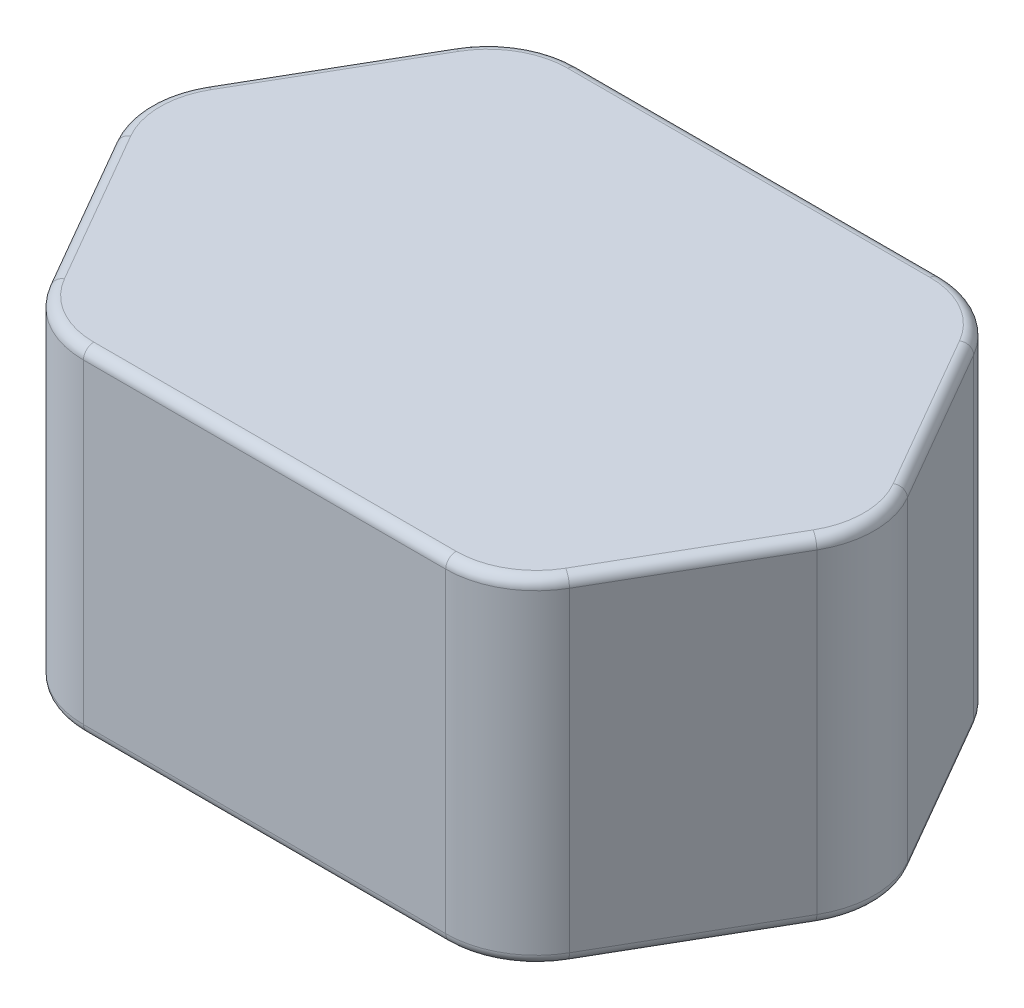
ISO-10303-21;
HEADER;
FILE_DESCRIPTION(('STEP AP214'),'2;1');
FILE_NAME('part.step','',(''),(''),'','','');
FILE_SCHEMA(('AUTOMOTIVE_DESIGN { 1 0 10303 214 1 1 1 1 }'));
ENDSEC;
DATA;
#1=APPLICATION_CONTEXT('core data for automotive mechanical design processes');
#2=APPLICATION_PROTOCOL_DEFINITION('international standard','automotive_design',2000,#1);
#3=PRODUCT_CONTEXT('',#1,'mechanical');
#4=PRODUCT('Part','Part','',(#3));
#5=PRODUCT_RELATED_PRODUCT_CATEGORY('part','',(#4));
#6=PRODUCT_DEFINITION_FORMATION('','',#4);
#7=PRODUCT_DEFINITION_CONTEXT('part definition',#1,'design');
#8=PRODUCT_DEFINITION('design','',#6,#7);
#9=PRODUCT_DEFINITION_SHAPE('','',#8);
#10=(LENGTH_UNIT() NAMED_UNIT(*) SI_UNIT(.MILLI.,.METRE.));
#11=(NAMED_UNIT(*) PLANE_ANGLE_UNIT() SI_UNIT($,.RADIAN.));
#12=(NAMED_UNIT(*) SI_UNIT($,.STERADIAN.) SOLID_ANGLE_UNIT());
#13=UNCERTAINTY_MEASURE_WITH_UNIT(LENGTH_MEASURE(1.E-05),#10,'distance_accuracy_value','');
#14=(GEOMETRIC_REPRESENTATION_CONTEXT(3) GLOBAL_UNCERTAINTY_ASSIGNED_CONTEXT((#13)) GLOBAL_UNIT_ASSIGNED_CONTEXT((#10,
#11,#12)) REPRESENTATION_CONTEXT('',''));
#15=CARTESIAN_POINT('',(0.,0.,0.));
#16=DIRECTION('',(0.,0.,1.));
#17=DIRECTION('',(1.,0.,0.));
#18=AXIS2_PLACEMENT_3D('',#15,#16,#17);
#19=CARTESIAN_POINT('',(0.,65.,0.));
#20=DIRECTION('',(0.,-1.,0.));
#21=DIRECTION('',(0.,0.,-1.));
#22=AXIS2_PLACEMENT_3D('',#19,#20,#21);
#23=CYLINDRICAL_SURFACE('',#22,17.4999999999999);
#24=DIRECTION('',(0.,-1.,0.));
#25=VECTOR('',#24,1.);
#26=CARTESIAN_POINT('',(-15.1554445662275,65.,-8.75000000000017));
#27=LINE('',#26,#25);
#28=CARTESIAN_POINT('',(-15.1554445662275,63.,-8.75000000000017));
#29=VERTEX_POINT('',#28);
#30=CARTESIAN_POINT('',(-15.1554445662275,2.,-8.75000000000017));
#31=VERTEX_POINT('',#30);
#32=EDGE_CURVE('E360',#29,#31,#27,.T.);
#33=ORIENTED_EDGE('',*,*,#32,.T.);
#34=CARTESIAN_POINT('',(0.,2.,0.));
#35=DIRECTION('',(0.,1.,0.));
#36=DIRECTION('',(0.,0.,1.));
#37=AXIS2_PLACEMENT_3D('',#34,#35,#36);
#38=CIRCLE('',#37,17.4999999999999);
#39=CARTESIAN_POINT('',(-15.1554445662276,2.,8.75000000000001));
#40=VERTEX_POINT('',#39);
#41=EDGE_CURVE('E305',#31,#40,#38,.T.);
#42=ORIENTED_EDGE('',*,*,#41,.T.);
#43=DIRECTION('',(0.,-1.,0.));
#44=VECTOR('',#43,1.);
#45=CARTESIAN_POINT('',(-15.1554445662276,65.,8.75000000000001));
#46=LINE('',#45,#44);
#47=CARTESIAN_POINT('',(-15.1554445662276,63.,8.75000000000001));
#48=VERTEX_POINT('',#47);
#49=EDGE_CURVE('E220',#48,#40,#46,.T.);
#50=ORIENTED_EDGE('',*,*,#49,.F.);
#51=CARTESIAN_POINT('',(0.,63.,0.));
#52=DIRECTION('',(0.,1.,0.));
#53=DIRECTION('',(0.,0.,1.));
#54=AXIS2_PLACEMENT_3D('',#51,#52,#53);
#55=CIRCLE('',#54,17.4999999999999);
#56=EDGE_CURVE('E303',#48,#29,#55,.F.);
#57=ORIENTED_EDGE('',*,*,#56,.T.);
#58=EDGE_LOOP('',(#33,#42,#50,#57));
#59=FACE_BOUND('',#58,.T.);
#60=ADVANCED_FACE('F36',(#59),#23,.T.);
#61=CARTESIAN_POINT('',(2.34455543377243,65.,39.0608891324552));
#62=DIRECTION('',(0.866025403784437,0.,-0.500000000000002));
#63=DIRECTION('',(-0.500000000000002,0.,-0.866025403784437));
#64=AXIS2_PLACEMENT_3D('',#61,#62,#63);
#65=PLANE('',#64);
#66=ORIENTED_EDGE('',*,*,#49,.T.);
#67=DIRECTION('',(0.500000000000002,0.,0.866025403784437));
#68=VECTOR('',#67,1.);
#69=CARTESIAN_POINT('',(2.34455543377243,2.,39.0608891324552));
#70=LINE('',#69,#68);
#71=CARTESIAN_POINT('',(2.34455543377247,2.,39.0608891324552));
#72=VERTEX_POINT('',#71);
#73=EDGE_CURVE('E219',#40,#72,#70,.T.);
#74=ORIENTED_EDGE('',*,*,#73,.T.);
#75=DIRECTION('',(0.,-1.,0.));
#76=VECTOR('',#75,1.);
#77=CARTESIAN_POINT('',(2.34455543377247,65.,39.0608891324552));
#78=LINE('',#77,#76);
#79=CARTESIAN_POINT('',(2.34455543377247,63.,39.0608891324552));
#80=VERTEX_POINT('',#79);
#81=EDGE_CURVE('E201',#80,#72,#78,.T.);
#82=ORIENTED_EDGE('',*,*,#81,.F.);
#83=DIRECTION('',(0.500000000000002,0.,0.866025403784437));
#84=VECTOR('',#83,1.);
#85=CARTESIAN_POINT('',(-15.1554445662276,63.,8.75000000000001));
#86=LINE('',#85,#84);
#87=EDGE_CURVE('E216',#80,#48,#86,.F.);
#88=ORIENTED_EDGE('',*,*,#87,.T.);
#89=EDGE_LOOP('',(#66,#74,#82,#88));
#90=FACE_BOUND('',#89,.T.);
#91=ADVANCED_FACE('F214',(#90),#65,.F.);
#92=CARTESIAN_POINT('',(17.5,65.,30.3108891324552));
#93=DIRECTION('',(0.,-1.,0.));
#94=DIRECTION('',(0.,0.,-1.));
#95=AXIS2_PLACEMENT_3D('',#92,#93,#94);
#96=CYLINDRICAL_SURFACE('',#95,17.4999999999999);
#97=ORIENTED_EDGE('',*,*,#81,.T.);
#98=CARTESIAN_POINT('',(17.5,2.,30.3108891324552));
#99=DIRECTION('',(0.,1.,0.));
#100=DIRECTION('',(0.,0.,1.));
#101=AXIS2_PLACEMENT_3D('',#98,#99,#100);
#102=CIRCLE('',#101,17.4999999999999);
#103=CARTESIAN_POINT('',(17.5,2.,47.810889132455));
#104=VERTEX_POINT('',#103);
#105=EDGE_CURVE('E208',#72,#104,#102,.T.);
#106=ORIENTED_EDGE('',*,*,#105,.T.);
#107=DIRECTION('',(0.,-1.,0.));
#108=VECTOR('',#107,1.);
#109=CARTESIAN_POINT('',(17.5,65.,47.810889132455));
#110=LINE('',#109,#108);
#111=CARTESIAN_POINT('',(17.5,63.,47.810889132455));
#112=VERTEX_POINT('',#111);
#113=EDGE_CURVE('E203',#112,#104,#110,.T.);
#114=ORIENTED_EDGE('',*,*,#113,.F.);
#115=CARTESIAN_POINT('',(17.5,63.,30.3108891324552));
#116=DIRECTION('',(0.,1.,0.));
#117=DIRECTION('',(0.,0.,1.));
#118=AXIS2_PLACEMENT_3D('',#115,#116,#117);
#119=CIRCLE('',#118,17.4999999999999);
#120=EDGE_CURVE('E198',#112,#80,#119,.F.);
#121=ORIENTED_EDGE('',*,*,#120,.T.);
#122=EDGE_LOOP('',(#97,#106,#114,#121));
#123=FACE_BOUND('',#122,.T.);
#124=ADVANCED_FACE('F200',(#123),#96,.T.);
#125=CARTESIAN_POINT('',(87.4999999999988,65.,47.8108891324551));
#126=DIRECTION('',(0.,0.,-1.));
#127=DIRECTION('',(-1.,0.,0.));
#128=AXIS2_PLACEMENT_3D('',#125,#126,#127);
#129=PLANE('',#128);
#130=ORIENTED_EDGE('',*,*,#113,.T.);
#131=DIRECTION('',(1.,0.,0.));
#132=VECTOR('',#131,1.);
#133=CARTESIAN_POINT('',(87.4999999999988,2.,47.8108891324551));
#134=LINE('',#133,#132);
#135=CARTESIAN_POINT('',(87.4999999999988,2.,47.8108891324551));
#136=VERTEX_POINT('',#135);
#137=EDGE_CURVE('E268',#104,#136,#134,.T.);
#138=ORIENTED_EDGE('',*,*,#137,.T.);
#139=DIRECTION('',(0.,-1.,0.));
#140=VECTOR('',#139,1.);
#141=CARTESIAN_POINT('',(87.4999999999988,65.,47.8108891324551));
#142=LINE('',#141,#140);
#143=CARTESIAN_POINT('',(87.4999999999988,63.,47.8108891324551));
#144=VERTEX_POINT('',#143);
#145=EDGE_CURVE('E410',#144,#136,#142,.T.);
#146=ORIENTED_EDGE('',*,*,#145,.F.);
#147=DIRECTION('',(1.,0.,0.));
#148=VECTOR('',#147,1.);
#149=CARTESIAN_POINT('',(17.5,63.,47.810889132455));
#150=LINE('',#149,#148);
#151=EDGE_CURVE('E266',#144,#112,#150,.F.);
#152=ORIENTED_EDGE('',*,*,#151,.T.);
#153=EDGE_LOOP('',(#130,#138,#146,#152));
#154=FACE_BOUND('',#153,.T.);
#155=ADVANCED_FACE('F419',(#154),#129,.F.);
#156=CARTESIAN_POINT('',(87.4999999999988,65.,30.310889132455));
#157=DIRECTION('',(0.,-1.,0.));
#158=DIRECTION('',(0.,0.,-1.));
#159=AXIS2_PLACEMENT_3D('',#156,#157,#158);
#160=CYLINDRICAL_SURFACE('',#159,17.5);
#161=ORIENTED_EDGE('',*,*,#145,.T.);
#162=CARTESIAN_POINT('',(87.4999999999988,2.,30.310889132455));
#163=DIRECTION('',(0.,1.,0.));
#164=DIRECTION('',(0.,0.,1.));
#165=AXIS2_PLACEMENT_3D('',#162,#163,#164);
#166=CIRCLE('',#165,17.5);
#167=CARTESIAN_POINT('',(102.655444566227,2.,39.060889132455));
#168=VERTEX_POINT('',#167);
#169=EDGE_CURVE('E272',#136,#168,#166,.T.);
#170=ORIENTED_EDGE('',*,*,#169,.T.);
#171=DIRECTION('',(0.,-1.,0.));
#172=VECTOR('',#171,1.);
#173=CARTESIAN_POINT('',(102.655444566227,65.,39.060889132455));
#174=LINE('',#173,#172);
#175=CARTESIAN_POINT('',(102.655444566227,63.,39.060889132455));
#176=VERTEX_POINT('',#175);
#177=EDGE_CURVE('E401',#176,#168,#174,.T.);
#178=ORIENTED_EDGE('',*,*,#177,.F.);
#179=CARTESIAN_POINT('',(87.4999999999988,63.,30.310889132455));
#180=DIRECTION('',(0.,1.,0.));
#181=DIRECTION('',(0.,0.,1.));
#182=AXIS2_PLACEMENT_3D('',#179,#180,#181);
#183=CIRCLE('',#182,17.5);
#184=EDGE_CURVE('E270',#176,#144,#183,.F.);
#185=ORIENTED_EDGE('',*,*,#184,.T.);
#186=EDGE_LOOP('',(#161,#170,#178,#185));
#187=FACE_BOUND('',#186,.T.);
#188=ADVANCED_FACE('F407',(#187),#160,.T.);
#189=CARTESIAN_POINT('',(120.155444566226,65.,8.74999999999999));
#190=DIRECTION('',(-0.866025403784439,0.,-0.499999999999999));
#191=DIRECTION('',(-0.499999999999999,0.,0.86602540378444));
#192=AXIS2_PLACEMENT_3D('',#189,#190,#191);
#193=PLANE('',#192);
#194=ORIENTED_EDGE('',*,*,#177,.T.);
#195=DIRECTION('',(0.499999999999999,0.,-0.86602540378444));
#196=VECTOR('',#195,1.);
#197=CARTESIAN_POINT('',(120.155444566226,2.,8.74999999999999));
#198=LINE('',#197,#196);
#199=CARTESIAN_POINT('',(120.155444566226,2.,8.75));
#200=VERTEX_POINT('',#199);
#201=EDGE_CURVE('E276',#168,#200,#198,.T.);
#202=ORIENTED_EDGE('',*,*,#201,.T.);
#203=DIRECTION('',(0.,-1.,0.));
#204=VECTOR('',#203,1.);
#205=CARTESIAN_POINT('',(120.155444566226,65.,8.75));
#206=LINE('',#205,#204);
#207=CARTESIAN_POINT('',(120.155444566226,63.,8.75));
#208=VERTEX_POINT('',#207);
#209=EDGE_CURVE('E404',#208,#200,#206,.T.);
#210=ORIENTED_EDGE('',*,*,#209,.F.);
#211=DIRECTION('',(0.499999999999999,0.,-0.86602540378444));
#212=VECTOR('',#211,1.);
#213=CARTESIAN_POINT('',(102.655444566227,63.,39.060889132455));
#214=LINE('',#213,#212);
#215=EDGE_CURVE('E274',#208,#176,#214,.F.);
#216=ORIENTED_EDGE('',*,*,#215,.T.);
#217=EDGE_LOOP('',(#194,#202,#210,#216));
#218=FACE_BOUND('',#217,.T.);
#219=ADVANCED_FACE('F400',(#218),#193,.F.);
#220=CARTESIAN_POINT('',(104.999999999999,65.,0.));
#221=DIRECTION('',(0.,-1.,0.));
#222=DIRECTION('',(0.,0.,-1.));
#223=AXIS2_PLACEMENT_3D('',#220,#221,#222);
#224=CYLINDRICAL_SURFACE('',#223,17.5);
#225=ORIENTED_EDGE('',*,*,#209,.T.);
#226=CARTESIAN_POINT('',(104.999999999999,2.,0.));
#227=DIRECTION('',(0.,1.,0.));
#228=DIRECTION('',(0.,0.,1.));
#229=AXIS2_PLACEMENT_3D('',#226,#227,#228);
#230=CIRCLE('',#229,17.5);
#231=CARTESIAN_POINT('',(120.155444566227,2.,-8.74999999999951));
#232=VERTEX_POINT('',#231);
#233=EDGE_CURVE('E280',#200,#232,#230,.T.);
#234=ORIENTED_EDGE('',*,*,#233,.T.);
#235=DIRECTION('',(0.,-1.,0.));
#236=VECTOR('',#235,1.);
#237=CARTESIAN_POINT('',(120.155444566227,65.,-8.74999999999951));
#238=LINE('',#237,#236);
#239=CARTESIAN_POINT('',(120.155444566227,63.,-8.74999999999951));
#240=VERTEX_POINT('',#239);
#241=EDGE_CURVE('E413',#240,#232,#238,.T.);
#242=ORIENTED_EDGE('',*,*,#241,.F.);
#243=CARTESIAN_POINT('',(104.999999999999,63.,0.));
#244=DIRECTION('',(0.,1.,0.));
#245=DIRECTION('',(0.,0.,1.));
#246=AXIS2_PLACEMENT_3D('',#243,#244,#245);
#247=CIRCLE('',#246,17.5);
#248=EDGE_CURVE('E278',#240,#208,#247,.F.);
#249=ORIENTED_EDGE('',*,*,#248,.T.);
#250=EDGE_LOOP('',(#225,#234,#242,#249));
#251=FACE_BOUND('',#250,.T.);
#252=ADVANCED_FACE('F745',(#251),#224,.T.);
#253=CARTESIAN_POINT('',(102.655444566228,65.,-39.0608891324548));
#254=DIRECTION('',(-0.866025403784455,0.,0.499999999999971));
#255=DIRECTION('',(0.499999999999971,0.,0.866025403784455));
#256=AXIS2_PLACEMENT_3D('',#253,#254,#255);
#257=PLANE('',#256);
#258=ORIENTED_EDGE('',*,*,#241,.T.);
#259=DIRECTION('',(-0.499999999999971,0.,-0.866025403784455));
#260=VECTOR('',#259,1.);
#261=CARTESIAN_POINT('',(102.655444566228,2.,-39.0608891324548));
#262=LINE('',#261,#260);
#263=CARTESIAN_POINT('',(102.655444566228,2.,-39.0608891324548));
#264=VERTEX_POINT('',#263);
#265=EDGE_CURVE('E284',#232,#264,#262,.T.);
#266=ORIENTED_EDGE('',*,*,#265,.T.);
#267=DIRECTION('',(0.,-1.,0.));
#268=VECTOR('',#267,1.);
#269=CARTESIAN_POINT('',(102.655444566228,65.,-39.0608891324548));
#270=LINE('',#269,#268);
#271=CARTESIAN_POINT('',(102.655444566228,63.,-39.0608891324548));
#272=VERTEX_POINT('',#271);
#273=EDGE_CURVE('E813',#272,#264,#270,.T.);
#274=ORIENTED_EDGE('',*,*,#273,.F.);
#275=DIRECTION('',(-0.499999999999971,0.,-0.866025403784455));
#276=VECTOR('',#275,1.);
#277=CARTESIAN_POINT('',(120.155444566227,63.,-8.74999999999951));
#278=LINE('',#277,#276);
#279=EDGE_CURVE('E282',#272,#240,#278,.F.);
#280=ORIENTED_EDGE('',*,*,#279,.T.);
#281=EDGE_LOOP('',(#258,#266,#274,#280));
#282=FACE_BOUND('',#281,.T.);
#283=ADVANCED_FACE('F736',(#282),#257,.F.);
#284=CARTESIAN_POINT('',(87.5,65.,-30.3108891324553));
#285=DIRECTION('',(0.,-1.,0.));
#286=DIRECTION('',(0.,0.,-1.));
#287=AXIS2_PLACEMENT_3D('',#284,#285,#286);
#288=CYLINDRICAL_SURFACE('',#287,17.5);
#289=ORIENTED_EDGE('',*,*,#273,.T.);
#290=CARTESIAN_POINT('',(87.5,2.,-30.3108891324553));
#291=DIRECTION('',(0.,1.,0.));
#292=DIRECTION('',(0.,0.,1.));
#293=AXIS2_PLACEMENT_3D('',#290,#291,#292);
#294=CIRCLE('',#293,17.5);
#295=CARTESIAN_POINT('',(87.5,2.,-47.8108891324553));
#296=VERTEX_POINT('',#295);
#297=EDGE_CURVE('E288',#264,#296,#294,.T.);
#298=ORIENTED_EDGE('',*,*,#297,.T.);
#299=DIRECTION('',(0.,-1.,0.));
#300=VECTOR('',#299,1.);
#301=CARTESIAN_POINT('',(87.5,65.,-47.8108891324553));
#302=LINE('',#301,#300);
#303=CARTESIAN_POINT('',(87.5,63.,-47.8108891324553));
#304=VERTEX_POINT('',#303);
#305=EDGE_CURVE('E815',#304,#296,#302,.T.);
#306=ORIENTED_EDGE('',*,*,#305,.F.);
#307=CARTESIAN_POINT('',(87.5,63.,-30.3108891324553));
#308=DIRECTION('',(0.,1.,0.));
#309=DIRECTION('',(0.,0.,1.));
#310=AXIS2_PLACEMENT_3D('',#307,#308,#309);
#311=CIRCLE('',#310,17.5);
#312=EDGE_CURVE('E286',#304,#272,#311,.F.);
#313=ORIENTED_EDGE('',*,*,#312,.T.);
#314=EDGE_LOOP('',(#289,#298,#306,#313));
#315=FACE_BOUND('',#314,.T.);
#316=ADVANCED_FACE('F727',(#315),#288,.T.);
#317=CARTESIAN_POINT('',(17.5000000000005,65.,-47.8108891324553));
#318=DIRECTION('',(0.,0.,1.));
#319=DIRECTION('',(1.,0.,0.));
#320=AXIS2_PLACEMENT_3D('',#317,#318,#319);
#321=PLANE('',#320);
#322=ORIENTED_EDGE('',*,*,#305,.T.);
#323=DIRECTION('',(-1.,0.,0.));
#324=VECTOR('',#323,1.);
#325=CARTESIAN_POINT('',(17.5000000000005,2.,-47.8108891324553));
#326=LINE('',#325,#324);
#327=CARTESIAN_POINT('',(17.5000000000005,2.,-47.8108891324553));
#328=VERTEX_POINT('',#327);
#329=EDGE_CURVE('E292',#296,#328,#326,.T.);
#330=ORIENTED_EDGE('',*,*,#329,.T.);
#331=DIRECTION('',(0.,-1.,0.));
#332=VECTOR('',#331,1.);
#333=CARTESIAN_POINT('',(17.5000000000005,65.,-47.8108891324553));
#334=LINE('',#333,#332);
#335=CARTESIAN_POINT('',(17.5000000000005,63.,-47.8108891324553));
#336=VERTEX_POINT('',#335);
#337=EDGE_CURVE('E820',#336,#328,#334,.T.);
#338=ORIENTED_EDGE('',*,*,#337,.F.);
#339=DIRECTION('',(-1.,0.,0.));
#340=VECTOR('',#339,1.);
#341=CARTESIAN_POINT('',(87.5,63.,-47.8108891324553));
#342=LINE('',#341,#340);
#343=EDGE_CURVE('E290',#336,#304,#342,.F.);
#344=ORIENTED_EDGE('',*,*,#343,.T.);
#345=EDGE_LOOP('',(#322,#330,#338,#344));
#346=FACE_BOUND('',#345,.T.);
#347=ADVANCED_FACE('F718',(#346),#321,.F.);
#348=CARTESIAN_POINT('',(17.5000000000005,65.,-30.3108891324553));
#349=DIRECTION('',(0.,-1.,0.));
#350=DIRECTION('',(0.,0.,-1.));
#351=AXIS2_PLACEMENT_3D('',#348,#349,#350);
#352=CYLINDRICAL_SURFACE('',#351,17.5);
#353=ORIENTED_EDGE('',*,*,#337,.T.);
#354=CARTESIAN_POINT('',(17.5000000000005,2.,-30.3108891324553));
#355=DIRECTION('',(0.,1.,0.));
#356=DIRECTION('',(0.,0.,1.));
#357=AXIS2_PLACEMENT_3D('',#354,#355,#356);
#358=CIRCLE('',#357,17.5);
#359=CARTESIAN_POINT('',(2.34455543377303,2.,-39.0608891324555));
#360=VERTEX_POINT('',#359);
#361=EDGE_CURVE('E296',#328,#360,#358,.T.);
#362=ORIENTED_EDGE('',*,*,#361,.T.);
#363=DIRECTION('',(0.,-1.,0.));
#364=VECTOR('',#363,1.);
#365=CARTESIAN_POINT('',(2.34455543377303,65.,-39.0608891324555));
#366=LINE('',#365,#364);
#367=CARTESIAN_POINT('',(2.34455543377303,63.,-39.0608891324555));
#368=VERTEX_POINT('',#367);
#369=EDGE_CURVE('E823',#368,#360,#366,.T.);
#370=ORIENTED_EDGE('',*,*,#369,.F.);
#371=CARTESIAN_POINT('',(17.5000000000005,63.,-30.3108891324553));
#372=DIRECTION('',(0.,1.,0.));
#373=DIRECTION('',(0.,0.,1.));
#374=AXIS2_PLACEMENT_3D('',#371,#372,#373);
#375=CIRCLE('',#374,17.5);
#376=EDGE_CURVE('E294',#368,#336,#375,.F.);
#377=ORIENTED_EDGE('',*,*,#376,.T.);
#378=EDGE_LOOP('',(#353,#362,#370,#377));
#379=FACE_BOUND('',#378,.T.);
#380=ADVANCED_FACE('F709',(#379),#352,.T.);
#381=CARTESIAN_POINT('',(-15.1554445662275,65.,-8.75000000000017));
#382=DIRECTION('',(0.866025403784432,0.,0.500000000000012));
#383=DIRECTION('',(0.500000000000012,0.,-0.866025403784432));
#384=AXIS2_PLACEMENT_3D('',#381,#382,#383);
#385=PLANE('',#384);
#386=ORIENTED_EDGE('',*,*,#369,.T.);
#387=DIRECTION('',(-0.500000000000012,0.,0.866025403784432));
#388=VECTOR('',#387,1.);
#389=CARTESIAN_POINT('',(-15.1554445662275,2.,-8.75000000000017));
#390=LINE('',#389,#388);
#391=EDGE_CURVE('E301',#360,#31,#390,.T.);
#392=ORIENTED_EDGE('',*,*,#391,.T.);
#393=ORIENTED_EDGE('',*,*,#32,.F.);
#394=DIRECTION('',(-0.500000000000012,0.,0.866025403784432));
#395=VECTOR('',#394,1.);
#396=CARTESIAN_POINT('',(2.34455543377303,63.,-39.0608891324555));
#397=LINE('',#396,#395);
#398=EDGE_CURVE('E298',#29,#368,#397,.F.);
#399=ORIENTED_EDGE('',*,*,#398,.T.);
#400=EDGE_LOOP('',(#386,#392,#393,#399));
#401=FACE_BOUND('',#400,.T.);
#402=ADVANCED_FACE('F701',(#401),#385,.F.);
#403=CARTESIAN_POINT('',(0.,65.,0.));
#404=DIRECTION('',(0.,1.,0.));
#405=DIRECTION('',(0.,0.,1.));
#406=AXIS2_PLACEMENT_3D('',#403,#404,#405);
#407=PLANE('',#406);
#408=CARTESIAN_POINT('',(17.5000000000005,65.,-30.3108891324553));
#409=DIRECTION('',(0.,1.,0.));
#410=DIRECTION('',(0.,0.,1.));
#411=AXIS2_PLACEMENT_3D('',#408,#409,#410);
#412=CIRCLE('',#411,15.5);
#413=CARTESIAN_POINT('',(17.5000000000005,65.,-45.8108891324553));
#414=VERTEX_POINT('',#413);
#415=CARTESIAN_POINT('',(4.07660624134185,65.,-38.0608891324555));
#416=VERTEX_POINT('',#415);
#417=EDGE_CURVE('E45',#414,#416,#412,.T.);
#418=ORIENTED_EDGE('',*,*,#417,.T.);
#419=DIRECTION('',(-0.500000000000012,0.,0.866025403784432));
#420=VECTOR('',#419,1.);
#421=CARTESIAN_POINT('',(-13.4233937586586,65.,-7.75000000000015));
#422=LINE('',#421,#420);
#423=CARTESIAN_POINT('',(-13.4233937586586,65.,-7.75000000000015));
#424=VERTEX_POINT('',#423);
#425=EDGE_CURVE('E11',#416,#424,#422,.T.);
#426=ORIENTED_EDGE('',*,*,#425,.T.);
#427=CARTESIAN_POINT('',(0.,65.,0.));
#428=DIRECTION('',(0.,1.,0.));
#429=DIRECTION('',(0.,0.,1.));
#430=AXIS2_PLACEMENT_3D('',#427,#428,#429);
#431=CIRCLE('',#430,15.4999999999999);
#432=CARTESIAN_POINT('',(-13.4233937586587,65.,7.75));
#433=VERTEX_POINT('',#432);
#434=EDGE_CURVE('E307',#424,#433,#431,.T.);
#435=ORIENTED_EDGE('',*,*,#434,.T.);
#436=DIRECTION('',(0.500000000000002,0.,0.866025403784437));
#437=VECTOR('',#436,1.);
#438=CARTESIAN_POINT('',(4.07660624134131,65.,38.0608891324552));
#439=LINE('',#438,#437);
#440=CARTESIAN_POINT('',(4.07660624134131,65.,38.0608891324552));
#441=VERTEX_POINT('',#440);
#442=EDGE_CURVE('E309',#433,#441,#439,.T.);
#443=ORIENTED_EDGE('',*,*,#442,.T.);
#444=CARTESIAN_POINT('',(17.5,65.,30.3108891324552));
#445=DIRECTION('',(0.,1.,0.));
#446=DIRECTION('',(0.,0.,1.));
#447=AXIS2_PLACEMENT_3D('',#444,#445,#446);
#448=CIRCLE('',#447,15.4999999999999);
#449=CARTESIAN_POINT('',(17.5,65.,45.8108891324551));
#450=VERTEX_POINT('',#449);
#451=EDGE_CURVE('E226',#441,#450,#448,.T.);
#452=ORIENTED_EDGE('',*,*,#451,.T.);
#453=DIRECTION('',(1.,0.,0.));
#454=VECTOR('',#453,1.);
#455=CARTESIAN_POINT('',(87.4999999999988,65.,45.810889132455));
#456=LINE('',#455,#454);
#457=CARTESIAN_POINT('',(87.4999999999988,65.,45.810889132455));
#458=VERTEX_POINT('',#457);
#459=EDGE_CURVE('E312',#450,#458,#456,.T.);
#460=ORIENTED_EDGE('',*,*,#459,.T.);
#461=CARTESIAN_POINT('',(87.4999999999988,65.,30.310889132455));
#462=DIRECTION('',(0.,1.,0.));
#463=DIRECTION('',(0.,0.,1.));
#464=AXIS2_PLACEMENT_3D('',#461,#462,#463);
#465=CIRCLE('',#464,15.5);
#466=CARTESIAN_POINT('',(100.923393758658,65.,38.060889132455));
#467=VERTEX_POINT('',#466);
#468=EDGE_CURVE('E314',#458,#467,#465,.T.);
#469=ORIENTED_EDGE('',*,*,#468,.T.);
#470=DIRECTION('',(0.499999999999999,0.,-0.86602540378444));
#471=VECTOR('',#470,1.);
#472=CARTESIAN_POINT('',(118.423393758657,65.,7.74999999999999));
#473=LINE('',#472,#471);
#474=CARTESIAN_POINT('',(118.423393758657,65.,7.75));
#475=VERTEX_POINT('',#474);
#476=EDGE_CURVE('E316',#467,#475,#473,.T.);
#477=ORIENTED_EDGE('',*,*,#476,.T.);
#478=CARTESIAN_POINT('',(104.999999999999,65.,0.));
#479=DIRECTION('',(0.,1.,0.));
#480=DIRECTION('',(0.,0.,1.));
#481=AXIS2_PLACEMENT_3D('',#478,#479,#480);
#482=CIRCLE('',#481,15.5);
#483=CARTESIAN_POINT('',(118.423393758658,65.,-7.74999999999956));
#484=VERTEX_POINT('',#483);
#485=EDGE_CURVE('E318',#475,#484,#482,.T.);
#486=ORIENTED_EDGE('',*,*,#485,.T.);
#487=DIRECTION('',(-0.499999999999971,0.,-0.866025403784455));
#488=VECTOR('',#487,1.);
#489=CARTESIAN_POINT('',(100.923393758659,65.,-38.0608891324548));
#490=LINE('',#489,#488);
#491=CARTESIAN_POINT('',(100.923393758659,65.,-38.0608891324549));
#492=VERTEX_POINT('',#491);
#493=EDGE_CURVE('E320',#484,#492,#490,.T.);
#494=ORIENTED_EDGE('',*,*,#493,.T.);
#495=CARTESIAN_POINT('',(87.5,65.,-30.3108891324553));
#496=DIRECTION('',(0.,1.,0.));
#497=DIRECTION('',(0.,0.,1.));
#498=AXIS2_PLACEMENT_3D('',#495,#496,#497);
#499=CIRCLE('',#498,15.5);
#500=CARTESIAN_POINT('',(87.5,65.,-45.8108891324553));
#501=VERTEX_POINT('',#500);
#502=EDGE_CURVE('E322',#492,#501,#499,.T.);
#503=ORIENTED_EDGE('',*,*,#502,.T.);
#504=DIRECTION('',(-1.,0.,0.));
#505=VECTOR('',#504,1.);
#506=CARTESIAN_POINT('',(17.5000000000005,65.,-45.8108891324553));
#507=LINE('',#506,#505);
#508=EDGE_CURVE('E56',#501,#414,#507,.T.);
#509=ORIENTED_EDGE('',*,*,#508,.T.);
#510=EDGE_LOOP('',(#418,#426,#435,#443,#452,#460,#469,#477,#486,#494,#503,#509));
#511=FACE_BOUND('',#510,.T.);
#512=ADVANCED_FACE('F693',(#511),#407,.T.);
#513=CARTESIAN_POINT('',(0.,0.,0.));
#514=DIRECTION('',(0.,1.,0.));
#515=DIRECTION('',(0.,0.,1.));
#516=AXIS2_PLACEMENT_3D('',#513,#514,#515);
#517=PLANE('',#516);
#518=CARTESIAN_POINT('',(17.5,0.,30.3108891324552));
#519=DIRECTION('',(0.,1.,0.));
#520=DIRECTION('',(0.,0.,1.));
#521=AXIS2_PLACEMENT_3D('',#518,#519,#520);
#522=CIRCLE('',#521,15.4999999999999);
#523=CARTESIAN_POINT('',(17.5,0.,45.810889132455));
#524=VERTEX_POINT('',#523);
#525=CARTESIAN_POINT('',(4.07660624134135,0.,38.0608891324552));
#526=VERTEX_POINT('',#525);
#527=EDGE_CURVE('E261',#524,#526,#522,.F.);
#528=ORIENTED_EDGE('',*,*,#527,.T.);
#529=DIRECTION('',(0.500000000000002,0.,0.866025403784437));
#530=VECTOR('',#529,1.);
#531=CARTESIAN_POINT('',(-13.4233937586587,0.,7.75));
#532=LINE('',#531,#530);
#533=CARTESIAN_POINT('',(-13.4233937586587,0.,7.75));
#534=VERTEX_POINT('',#533);
#535=EDGE_CURVE('E209',#526,#534,#532,.F.);
#536=ORIENTED_EDGE('',*,*,#535,.T.);
#537=CARTESIAN_POINT('',(0.,0.,0.));
#538=DIRECTION('',(0.,1.,0.));
#539=DIRECTION('',(0.,0.,1.));
#540=AXIS2_PLACEMENT_3D('',#537,#538,#539);
#541=CIRCLE('',#540,15.4999999999999);
#542=CARTESIAN_POINT('',(-13.4233937586586,0.,-7.75000000000015));
#543=VERTEX_POINT('',#542);
#544=EDGE_CURVE('E238',#534,#543,#541,.F.);
#545=ORIENTED_EDGE('',*,*,#544,.T.);
#546=DIRECTION('',(-0.500000000000012,0.,0.866025403784432));
#547=VECTOR('',#546,1.);
#548=CARTESIAN_POINT('',(-13.4233937586586,0.,-7.75000000000015));
#549=LINE('',#548,#547);
#550=CARTESIAN_POINT('',(4.07660624134189,0.,-38.0608891324555));
#551=VERTEX_POINT('',#550);
#552=EDGE_CURVE('E243',#543,#551,#549,.F.);
#553=ORIENTED_EDGE('',*,*,#552,.T.);
#554=CARTESIAN_POINT('',(17.5000000000005,0.,-30.3108891324553));
#555=DIRECTION('',(0.,1.,0.));
#556=DIRECTION('',(0.,0.,1.));
#557=AXIS2_PLACEMENT_3D('',#554,#555,#556);
#558=CIRCLE('',#557,15.5);
#559=CARTESIAN_POINT('',(17.5000000000005,0.,-45.8108891324553));
#560=VERTEX_POINT('',#559);
#561=EDGE_CURVE('E245',#551,#560,#558,.F.);
#562=ORIENTED_EDGE('',*,*,#561,.T.);
#563=DIRECTION('',(-1.,0.,0.));
#564=VECTOR('',#563,1.);
#565=CARTESIAN_POINT('',(0.,0.,-45.8108891324553));
#566=LINE('',#565,#564);
#567=CARTESIAN_POINT('',(87.5,0.,-45.8108891324553));
#568=VERTEX_POINT('',#567);
#569=EDGE_CURVE('E247',#560,#568,#566,.F.);
#570=ORIENTED_EDGE('',*,*,#569,.T.);
#571=CARTESIAN_POINT('',(87.5,0.,-30.3108891324553));
#572=DIRECTION('',(0.,1.,0.));
#573=DIRECTION('',(0.,0.,1.));
#574=AXIS2_PLACEMENT_3D('',#571,#572,#573);
#575=CIRCLE('',#574,15.5);
#576=CARTESIAN_POINT('',(100.923393758659,0.,-38.0608891324548));
#577=VERTEX_POINT('',#576);
#578=EDGE_CURVE('E249',#568,#577,#575,.F.);
#579=ORIENTED_EDGE('',*,*,#578,.T.);
#580=DIRECTION('',(-0.499999999999971,0.,-0.866025403784455));
#581=VECTOR('',#580,1.);
#582=CARTESIAN_POINT('',(92.1733937586611,0.,-53.2163336986802));
#583=LINE('',#582,#581);
#584=CARTESIAN_POINT('',(118.423393758658,0.,-7.74999999999957));
#585=VERTEX_POINT('',#584);
#586=EDGE_CURVE('E251',#577,#585,#583,.F.);
#587=ORIENTED_EDGE('',*,*,#586,.T.);
#588=CARTESIAN_POINT('',(104.999999999999,0.,0.));
#589=DIRECTION('',(0.,1.,0.));
#590=DIRECTION('',(0.,0.,1.));
#591=AXIS2_PLACEMENT_3D('',#588,#589,#590);
#592=CIRCLE('',#591,15.5);
#593=CARTESIAN_POINT('',(118.423393758657,0.,7.75));
#594=VERTEX_POINT('',#593);
#595=EDGE_CURVE('E253',#585,#594,#592,.F.);
#596=ORIENTED_EDGE('',*,*,#595,.T.);
#597=DIRECTION('',(0.499999999999999,0.,-0.86602540378444));
#598=VECTOR('',#597,1.);
#599=CARTESIAN_POINT('',(92.1733937586579,0.,53.2163336986823));
#600=LINE('',#599,#598);
#601=CARTESIAN_POINT('',(100.923393758658,0.,38.060889132455));
#602=VERTEX_POINT('',#601);
#603=EDGE_CURVE('E255',#594,#602,#600,.F.);
#604=ORIENTED_EDGE('',*,*,#603,.T.);
#605=CARTESIAN_POINT('',(87.4999999999988,0.,30.310889132455));
#606=DIRECTION('',(0.,1.,0.));
#607=DIRECTION('',(0.,0.,1.));
#608=AXIS2_PLACEMENT_3D('',#605,#606,#607);
#609=CIRCLE('',#608,15.5);
#610=CARTESIAN_POINT('',(87.4999999999988,0.,45.8108891324551));
#611=VERTEX_POINT('',#610);
#612=EDGE_CURVE('E257',#602,#611,#609,.F.);
#613=ORIENTED_EDGE('',*,*,#612,.T.);
#614=DIRECTION('',(1.,0.,0.));
#615=VECTOR('',#614,1.);
#616=CARTESIAN_POINT('',(0.,0.,45.810889132455));
#617=LINE('',#616,#615);
#618=EDGE_CURVE('E259',#611,#524,#617,.F.);
#619=ORIENTED_EDGE('',*,*,#618,.T.);
#620=EDGE_LOOP('',(#528,#536,#545,#553,#562,#570,#579,#587,#596,#604,#613,#619));
#621=FACE_BOUND('',#620,.T.);
#622=ADVANCED_FACE('F433',(#621),#517,.F.);
#623=CARTESIAN_POINT('',(100.923393758659,2.,-38.0608891324549));
#624=DIRECTION('',(-0.499999999999971,0.,-0.866025403784455));
#625=DIRECTION('',(-0.866025403784455,0.,0.499999999999971));
#626=AXIS2_PLACEMENT_3D('',#623,#624,#625);
#627=CYLINDRICAL_SURFACE('',#626,2.);
#628=CARTESIAN_POINT('',(118.423393758658,2.,-7.74999999999957));
#629=DIRECTION('',(0.49999999999997,0.,0.866025403784456));
#630=DIRECTION('',(0.866025403784456,0.,-0.49999999999997));
#631=AXIS2_PLACEMENT_3D('',#628,#629,#630);
#632=CIRCLE('',#631,2.);
#633=EDGE_CURVE('E354',#585,#232,#632,.T.);
#634=ORIENTED_EDGE('',*,*,#633,.F.);
#635=ORIENTED_EDGE('',*,*,#586,.F.);
#636=CARTESIAN_POINT('',(100.923393758659,2.,-38.0608891324548));
#637=DIRECTION('',(-0.499999999999972,0.,-0.866025403784455));
#638=DIRECTION('',(-0.866025403784455,0.,0.499999999999972));
#639=AXIS2_PLACEMENT_3D('',#636,#637,#638);
#640=CIRCLE('',#639,2.);
#641=EDGE_CURVE('E357',#264,#577,#640,.T.);
#642=ORIENTED_EDGE('',*,*,#641,.F.);
#643=ORIENTED_EDGE('',*,*,#265,.F.);
#644=EDGE_LOOP('',(#634,#635,#642,#643));
#645=FACE_BOUND('',#644,.T.);
#646=ADVANCED_FACE('F465',(#645),#627,.T.);
#647=CARTESIAN_POINT('',(87.5,2.,-30.3108891324553));
#648=DIRECTION('',(0.,1.,0.));
#649=DIRECTION('',(0.,0.,1.));
#650=AXIS2_PLACEMENT_3D('',#647,#648,#649);
#651=TOROIDAL_SURFACE('',#650,15.5,2.);
#652=ORIENTED_EDGE('',*,*,#641,.T.);
#653=ORIENTED_EDGE('',*,*,#578,.F.);
#654=CARTESIAN_POINT('',(87.5,2.,-45.8108891324553));
#655=DIRECTION('',(-1.,0.,0.));
#656=DIRECTION('',(0.,0.,1.));
#657=AXIS2_PLACEMENT_3D('',#654,#655,#656);
#658=CIRCLE('',#657,2.);
#659=EDGE_CURVE('E351',#296,#568,#658,.T.);
#660=ORIENTED_EDGE('',*,*,#659,.F.);
#661=ORIENTED_EDGE('',*,*,#297,.F.);
#662=EDGE_LOOP('',(#652,#653,#660,#661));
#663=FACE_BOUND('',#662,.T.);
#664=ADVANCED_FACE('F460',(#663),#651,.T.);
#665=CARTESIAN_POINT('',(104.999999999999,2.,0.));
#666=DIRECTION('',(0.,1.,0.));
#667=DIRECTION('',(0.,0.,1.));
#668=AXIS2_PLACEMENT_3D('',#665,#666,#667);
#669=TOROIDAL_SURFACE('',#668,15.5,2.);
#670=ORIENTED_EDGE('',*,*,#633,.T.);
#671=ORIENTED_EDGE('',*,*,#233,.F.);
#672=CARTESIAN_POINT('',(118.423393758657,2.,7.75));
#673=DIRECTION('',(-0.499999999999996,0.,0.866025403784441));
#674=DIRECTION('',(0.866025403784441,0.,0.499999999999996));
#675=AXIS2_PLACEMENT_3D('',#672,#673,#674);
#676=CIRCLE('',#675,2.);
#677=EDGE_CURVE('E348',#594,#200,#676,.T.);
#678=ORIENTED_EDGE('',*,*,#677,.F.);
#679=ORIENTED_EDGE('',*,*,#595,.F.);
#680=EDGE_LOOP('',(#670,#671,#678,#679));
#681=FACE_BOUND('',#680,.T.);
#682=ADVANCED_FACE('F471',(#681),#669,.T.);
#683=CARTESIAN_POINT('',(17.5000000000005,2.,-45.8108891324553));
#684=DIRECTION('',(-1.,0.,0.));
#685=DIRECTION('',(0.,0.,1.));
#686=AXIS2_PLACEMENT_3D('',#683,#684,#685);
#687=CYLINDRICAL_SURFACE('',#686,2.);
#688=ORIENTED_EDGE('',*,*,#659,.T.);
#689=ORIENTED_EDGE('',*,*,#569,.F.);
#690=CARTESIAN_POINT('',(17.5000000000005,2.,-45.8108891324553));
#691=DIRECTION('',(-1.,0.,0.));
#692=DIRECTION('',(0.,0.,1.));
#693=AXIS2_PLACEMENT_3D('',#690,#691,#692);
#694=CIRCLE('',#693,2.);
#695=EDGE_CURVE('E345',#328,#560,#694,.T.);
#696=ORIENTED_EDGE('',*,*,#695,.F.);
#697=ORIENTED_EDGE('',*,*,#329,.F.);
#698=EDGE_LOOP('',(#688,#689,#696,#697));
#699=FACE_BOUND('',#698,.T.);
#700=ADVANCED_FACE('F455',(#699),#687,.T.);
#701=CARTESIAN_POINT('',(118.423393758657,2.,7.75));
#702=DIRECTION('',(0.499999999999999,0.,-0.86602540378444));
#703=DIRECTION('',(-0.86602540378444,0.,-0.499999999999999));
#704=AXIS2_PLACEMENT_3D('',#701,#702,#703);
#705=CYLINDRICAL_SURFACE('',#704,2.);
#706=ORIENTED_EDGE('',*,*,#677,.T.);
#707=ORIENTED_EDGE('',*,*,#201,.F.);
#708=CARTESIAN_POINT('',(100.923393758658,2.,38.060889132455));
#709=DIRECTION('',(-0.500000000000002,0.,0.866025403784438));
#710=DIRECTION('',(0.866025403784438,0.,0.500000000000002));
#711=AXIS2_PLACEMENT_3D('',#708,#709,#710);
#712=CIRCLE('',#711,2.);
#713=EDGE_CURVE('E342',#602,#168,#712,.T.);
#714=ORIENTED_EDGE('',*,*,#713,.F.);
#715=ORIENTED_EDGE('',*,*,#603,.F.);
#716=EDGE_LOOP('',(#706,#707,#714,#715));
#717=FACE_BOUND('',#716,.T.);
#718=ADVANCED_FACE('F476',(#717),#705,.T.);
#719=CARTESIAN_POINT('',(17.5000000000005,2.,-30.3108891324553));
#720=DIRECTION('',(0.,1.,0.));
#721=DIRECTION('',(0.,0.,1.));
#722=AXIS2_PLACEMENT_3D('',#719,#720,#721);
#723=TOROIDAL_SURFACE('',#722,15.5,2.);
#724=ORIENTED_EDGE('',*,*,#695,.T.);
#725=ORIENTED_EDGE('',*,*,#561,.F.);
#726=CARTESIAN_POINT('',(4.07660624134185,2.,-38.0608891324555));
#727=DIRECTION('',(-0.500000000000011,0.,0.866025403784432));
#728=DIRECTION('',(0.866025403784432,0.,0.500000000000011));
#729=AXIS2_PLACEMENT_3D('',#726,#727,#728);
#730=CIRCLE('',#729,2.);
#731=EDGE_CURVE('E339',#360,#551,#730,.T.);
#732=ORIENTED_EDGE('',*,*,#731,.F.);
#733=ORIENTED_EDGE('',*,*,#361,.F.);
#734=EDGE_LOOP('',(#724,#725,#732,#733));
#735=FACE_BOUND('',#734,.T.);
#736=ADVANCED_FACE('F450',(#735),#723,.T.);
#737=CARTESIAN_POINT('',(87.4999999999988,2.,30.310889132455));
#738=DIRECTION('',(0.,1.,0.));
#739=DIRECTION('',(0.,0.,1.));
#740=AXIS2_PLACEMENT_3D('',#737,#738,#739);
#741=TOROIDAL_SURFACE('',#740,15.5,2.);
#742=ORIENTED_EDGE('',*,*,#713,.T.);
#743=ORIENTED_EDGE('',*,*,#169,.F.);
#744=CARTESIAN_POINT('',(87.4999999999988,2.,45.8108891324551));
#745=DIRECTION('',(-1.,0.,0.));
#746=DIRECTION('',(0.,0.,1.));
#747=AXIS2_PLACEMENT_3D('',#744,#745,#746);
#748=CIRCLE('',#747,2.);
#749=EDGE_CURVE('E336',#611,#136,#748,.T.);
#750=ORIENTED_EDGE('',*,*,#749,.F.);
#751=ORIENTED_EDGE('',*,*,#612,.F.);
#752=EDGE_LOOP('',(#742,#743,#750,#751));
#753=FACE_BOUND('',#752,.T.);
#754=ADVANCED_FACE('F478',(#753),#741,.T.);
#755=CARTESIAN_POINT('',(-13.4233937586586,2.,-7.75000000000015));
#756=DIRECTION('',(-0.500000000000012,0.,0.866025403784432));
#757=DIRECTION('',(0.866025403784432,0.,0.500000000000012));
#758=AXIS2_PLACEMENT_3D('',#755,#756,#757);
#759=CYLINDRICAL_SURFACE('',#758,2.);
#760=ORIENTED_EDGE('',*,*,#731,.T.);
#761=ORIENTED_EDGE('',*,*,#552,.F.);
#762=CARTESIAN_POINT('',(-13.4233937586586,2.,-7.75000000000015));
#763=DIRECTION('',(-0.500000000000012,0.,0.866025403784432));
#764=DIRECTION('',(0.866025403784432,0.,0.500000000000012));
#765=AXIS2_PLACEMENT_3D('',#762,#763,#764);
#766=CIRCLE('',#765,2.);
#767=EDGE_CURVE('E333',#31,#543,#766,.T.);
#768=ORIENTED_EDGE('',*,*,#767,.F.);
#769=ORIENTED_EDGE('',*,*,#391,.F.);
#770=EDGE_LOOP('',(#760,#761,#768,#769));
#771=FACE_BOUND('',#770,.T.);
#772=ADVANCED_FACE('F445',(#771),#759,.T.);
#773=CARTESIAN_POINT('',(87.4999999999988,2.,45.810889132455));
#774=DIRECTION('',(1.,0.,0.));
#775=DIRECTION('',(0.,0.,-1.));
#776=AXIS2_PLACEMENT_3D('',#773,#774,#775);
#777=CYLINDRICAL_SURFACE('',#776,2.);
#778=ORIENTED_EDGE('',*,*,#749,.T.);
#779=ORIENTED_EDGE('',*,*,#137,.F.);
#780=CARTESIAN_POINT('',(17.5,2.,45.810889132455));
#781=DIRECTION('',(-1.,0.,0.));
#782=DIRECTION('',(0.,0.,1.));
#783=AXIS2_PLACEMENT_3D('',#780,#781,#782);
#784=CIRCLE('',#783,2.);
#785=EDGE_CURVE('E330',#524,#104,#784,.T.);
#786=ORIENTED_EDGE('',*,*,#785,.F.);
#787=ORIENTED_EDGE('',*,*,#618,.F.);
#788=EDGE_LOOP('',(#778,#779,#786,#787));
#789=FACE_BOUND('',#788,.T.);
#790=ADVANCED_FACE('F423',(#789),#777,.T.);
#791=CARTESIAN_POINT('',(0.,2.,0.));
#792=DIRECTION('',(0.,1.,0.));
#793=DIRECTION('',(0.,0.,1.));
#794=AXIS2_PLACEMENT_3D('',#791,#792,#793);
#795=TOROIDAL_SURFACE('',#794,15.4999999999999,2.);
#796=ORIENTED_EDGE('',*,*,#767,.T.);
#797=ORIENTED_EDGE('',*,*,#544,.F.);
#798=CARTESIAN_POINT('',(-13.4233937586587,2.,7.75));
#799=DIRECTION('',(0.500000000000002,0.,0.866025403784437));
#800=DIRECTION('',(0.866025403784437,0.,-0.500000000000002));
#801=AXIS2_PLACEMENT_3D('',#798,#799,#800);
#802=CIRCLE('',#801,2.);
#803=EDGE_CURVE('E328',#40,#534,#802,.T.);
#804=ORIENTED_EDGE('',*,*,#803,.F.);
#805=ORIENTED_EDGE('',*,*,#41,.F.);
#806=EDGE_LOOP('',(#796,#797,#804,#805));
#807=FACE_BOUND('',#806,.T.);
#808=ADVANCED_FACE('F440',(#807),#795,.T.);
#809=CARTESIAN_POINT('',(17.5,2.,30.3108891324552));
#810=DIRECTION('',(0.,1.,0.));
#811=DIRECTION('',(0.,0.,1.));
#812=AXIS2_PLACEMENT_3D('',#809,#810,#811);
#813=TOROIDAL_SURFACE('',#812,15.4999999999999,2.);
#814=ORIENTED_EDGE('',*,*,#785,.T.);
#815=ORIENTED_EDGE('',*,*,#105,.F.);
#816=CARTESIAN_POINT('',(4.07660624134135,2.,38.0608891324552));
#817=DIRECTION('',(-0.500000000000004,0.,-0.866025403784436));
#818=DIRECTION('',(-0.866025403784436,0.,0.500000000000004));
#819=AXIS2_PLACEMENT_3D('',#816,#817,#818);
#820=CIRCLE('',#819,2.);
#821=EDGE_CURVE('E326',#526,#72,#820,.T.);
#822=ORIENTED_EDGE('',*,*,#821,.F.);
#823=ORIENTED_EDGE('',*,*,#527,.F.);
#824=EDGE_LOOP('',(#814,#815,#822,#823));
#825=FACE_BOUND('',#824,.T.);
#826=ADVANCED_FACE('F429',(#825),#813,.T.);
#827=CARTESIAN_POINT('',(4.07660624134131,2.,38.0608891324552));
#828=DIRECTION('',(0.500000000000002,0.,0.866025403784437));
#829=DIRECTION('',(0.866025403784437,0.,-0.500000000000002));
#830=AXIS2_PLACEMENT_3D('',#827,#828,#829);
#831=CYLINDRICAL_SURFACE('',#830,2.);
#832=ORIENTED_EDGE('',*,*,#803,.T.);
#833=ORIENTED_EDGE('',*,*,#535,.F.);
#834=ORIENTED_EDGE('',*,*,#821,.T.);
#835=ORIENTED_EDGE('',*,*,#73,.F.);
#836=EDGE_LOOP('',(#832,#833,#834,#835));
#837=FACE_BOUND('',#836,.T.);
#838=ADVANCED_FACE('F435',(#837),#831,.T.);
#839=CARTESIAN_POINT('',(92.173393758658,63.,53.2163336986823));
#840=DIRECTION('',(-0.499999999999999,0.,0.86602540378444));
#841=DIRECTION('',(0.86602540378444,0.,0.499999999999999));
#842=AXIS2_PLACEMENT_3D('',#839,#840,#841);
#843=CYLINDRICAL_SURFACE('',#842,2.);
#844=CARTESIAN_POINT('',(100.923393758658,63.,38.060889132455));
#845=DIRECTION('',(-0.499999999999996,0.,0.866025403784441));
#846=DIRECTION('',(0.866025403784441,0.,0.499999999999996));
#847=AXIS2_PLACEMENT_3D('',#844,#845,#846);
#848=CIRCLE('',#847,2.);
#849=EDGE_CURVE('E380',#176,#467,#848,.T.);
#850=ORIENTED_EDGE('',*,*,#849,.F.);
#851=ORIENTED_EDGE('',*,*,#215,.F.);
#852=CARTESIAN_POINT('',(118.423393758657,63.,7.75));
#853=DIRECTION('',(0.499999999999999,0.,-0.866025403784439));
#854=DIRECTION('',(-0.866025403784439,0.,-0.499999999999999));
#855=AXIS2_PLACEMENT_3D('',#852,#853,#854);
#856=CIRCLE('',#855,2.);
#857=EDGE_CURVE('E40',#475,#208,#856,.T.);
#858=ORIENTED_EDGE('',*,*,#857,.F.);
#859=ORIENTED_EDGE('',*,*,#476,.F.);
#860=EDGE_LOOP('',(#850,#851,#858,#859));
#861=FACE_BOUND('',#860,.T.);
#862=ADVANCED_FACE('F38',(#861),#843,.T.);
#863=CARTESIAN_POINT('',(104.999999999999,63.,0.));
#864=DIRECTION('',(0.,1.,0.));
#865=DIRECTION('',(0.,0.,1.));
#866=AXIS2_PLACEMENT_3D('',#863,#864,#865);
#867=TOROIDAL_SURFACE('',#866,15.5,2.);
#868=ORIENTED_EDGE('',*,*,#857,.T.);
#869=ORIENTED_EDGE('',*,*,#248,.F.);
#870=CARTESIAN_POINT('',(118.423393758658,63.,-7.74999999999956));
#871=DIRECTION('',(-0.499999999999974,0.,-0.866025403784454));
#872=DIRECTION('',(-0.866025403784454,0.,0.499999999999974));
#873=AXIS2_PLACEMENT_3D('',#870,#871,#872);
#874=CIRCLE('',#873,2.);
#875=EDGE_CURVE('E378',#484,#240,#874,.T.);
#876=ORIENTED_EDGE('',*,*,#875,.F.);
#877=ORIENTED_EDGE('',*,*,#485,.F.);
#878=EDGE_LOOP('',(#868,#869,#876,#877));
#879=FACE_BOUND('',#878,.T.);
#880=ADVANCED_FACE('F391',(#879),#867,.T.);
#881=CARTESIAN_POINT('',(87.4999999999988,63.,30.310889132455));
#882=DIRECTION('',(0.,1.,0.));
#883=DIRECTION('',(0.,0.,1.));
#884=AXIS2_PLACEMENT_3D('',#881,#882,#883);
#885=TOROIDAL_SURFACE('',#884,15.5,2.);
#886=ORIENTED_EDGE('',*,*,#849,.T.);
#887=ORIENTED_EDGE('',*,*,#468,.F.);
#888=CARTESIAN_POINT('',(87.4999999999988,63.,45.8108891324551));
#889=DIRECTION('',(-1.,0.,0.));
#890=DIRECTION('',(0.,0.,1.));
#891=AXIS2_PLACEMENT_3D('',#888,#889,#890);
#892=CIRCLE('',#891,2.);
#893=EDGE_CURVE('E375',#144,#458,#892,.T.);
#894=ORIENTED_EDGE('',*,*,#893,.F.);
#895=ORIENTED_EDGE('',*,*,#184,.F.);
#896=EDGE_LOOP('',(#886,#887,#894,#895));
#897=FACE_BOUND('',#896,.T.);
#898=ADVANCED_FACE('F531',(#897),#885,.T.);
#899=CARTESIAN_POINT('',(92.1733937586611,63.,-53.2163336986802));
#900=DIRECTION('',(0.499999999999971,0.,0.866025403784455));
#901=DIRECTION('',(0.866025403784455,0.,-0.499999999999971));
#902=AXIS2_PLACEMENT_3D('',#899,#900,#901);
#903=CYLINDRICAL_SURFACE('',#902,2.);
#904=ORIENTED_EDGE('',*,*,#875,.T.);
#905=ORIENTED_EDGE('',*,*,#279,.F.);
#906=CARTESIAN_POINT('',(100.923393758659,63.,-38.0608891324549));
#907=DIRECTION('',(-0.499999999999969,0.,-0.866025403784456));
#908=DIRECTION('',(-0.866025403784456,0.,0.499999999999969));
#909=AXIS2_PLACEMENT_3D('',#906,#907,#908);
#910=CIRCLE('',#909,2.);
#911=EDGE_CURVE('E372',#492,#272,#910,.T.);
#912=ORIENTED_EDGE('',*,*,#911,.F.);
#913=ORIENTED_EDGE('',*,*,#493,.F.);
#914=EDGE_LOOP('',(#904,#905,#912,#913));
#915=FACE_BOUND('',#914,.T.);
#916=ADVANCED_FACE('F537',(#915),#903,.T.);
#917=CARTESIAN_POINT('',(0.,63.,45.810889132455));
#918=DIRECTION('',(-1.,0.,0.));
#919=DIRECTION('',(0.,0.,1.));
#920=AXIS2_PLACEMENT_3D('',#917,#918,#919);
#921=CYLINDRICAL_SURFACE('',#920,2.);
#922=ORIENTED_EDGE('',*,*,#893,.T.);
#923=ORIENTED_EDGE('',*,*,#459,.F.);
#924=CARTESIAN_POINT('',(17.5,63.,45.810889132455));
#925=DIRECTION('',(-1.,0.,0.));
#926=DIRECTION('',(0.,0.,1.));
#927=AXIS2_PLACEMENT_3D('',#924,#925,#926);
#928=CIRCLE('',#927,2.);
#929=EDGE_CURVE('E370',#112,#450,#928,.T.);
#930=ORIENTED_EDGE('',*,*,#929,.F.);
#931=ORIENTED_EDGE('',*,*,#151,.F.);
#932=EDGE_LOOP('',(#922,#923,#930,#931));
#933=FACE_BOUND('',#932,.T.);
#934=ADVANCED_FACE('F544',(#933),#921,.T.);
#935=CARTESIAN_POINT('',(87.5,63.,-30.3108891324553));
#936=DIRECTION('',(0.,1.,0.));
#937=DIRECTION('',(0.,0.,1.));
#938=AXIS2_PLACEMENT_3D('',#935,#936,#937);
#939=TOROIDAL_SURFACE('',#938,15.5,2.);
#940=ORIENTED_EDGE('',*,*,#911,.T.);
#941=ORIENTED_EDGE('',*,*,#312,.F.);
#942=CARTESIAN_POINT('',(87.5,63.,-45.8108891324553));
#943=DIRECTION('',(-1.,0.,0.));
#944=DIRECTION('',(0.,0.,1.));
#945=AXIS2_PLACEMENT_3D('',#942,#943,#944);
#946=CIRCLE('',#945,2.);
#947=EDGE_CURVE('E229',#501,#304,#946,.T.);
#948=ORIENTED_EDGE('',*,*,#947,.F.);
#949=ORIENTED_EDGE('',*,*,#502,.F.);
#950=EDGE_LOOP('',(#940,#941,#948,#949));
#951=FACE_BOUND('',#950,.T.);
#952=ADVANCED_FACE('F552',(#951),#939,.T.);
#953=CARTESIAN_POINT('',(17.5,63.,30.3108891324552));
#954=DIRECTION('',(0.,1.,0.));
#955=DIRECTION('',(0.,0.,1.));
#956=AXIS2_PLACEMENT_3D('',#953,#954,#955);
#957=TOROIDAL_SURFACE('',#956,15.4999999999999,2.);
#958=ORIENTED_EDGE('',*,*,#929,.T.);
#959=ORIENTED_EDGE('',*,*,#451,.F.);
#960=CARTESIAN_POINT('',(4.07660624134135,63.,38.0608891324552));
#961=DIRECTION('',(-0.500000000000004,0.,-0.866025403784437));
#962=DIRECTION('',(-0.866025403784436,0.,0.500000000000004));
#963=AXIS2_PLACEMENT_3D('',#960,#961,#962);
#964=CIRCLE('',#963,2.);
#965=EDGE_CURVE('E224',#80,#441,#964,.T.);
#966=ORIENTED_EDGE('',*,*,#965,.F.);
#967=ORIENTED_EDGE('',*,*,#120,.F.);
#968=EDGE_LOOP('',(#958,#959,#966,#967));
#969=FACE_BOUND('',#968,.T.);
#970=ADVANCED_FACE('F225',(#969),#957,.T.);
#971=CARTESIAN_POINT('',(0.,63.,-45.8108891324553));
#972=DIRECTION('',(1.,0.,0.));
#973=DIRECTION('',(0.,0.,-1.));
#974=AXIS2_PLACEMENT_3D('',#971,#972,#973);
#975=CYLINDRICAL_SURFACE('',#974,2.);
#976=ORIENTED_EDGE('',*,*,#947,.T.);
#977=ORIENTED_EDGE('',*,*,#343,.F.);
#978=CARTESIAN_POINT('',(17.5000000000005,63.,-45.8108891324553));
#979=DIRECTION('',(-1.,0.,0.));
#980=DIRECTION('',(0.,0.,1.));
#981=AXIS2_PLACEMENT_3D('',#978,#979,#980);
#982=CIRCLE('',#981,2.);
#983=EDGE_CURVE('E230',#414,#336,#982,.T.);
#984=ORIENTED_EDGE('',*,*,#983,.F.);
#985=ORIENTED_EDGE('',*,*,#508,.F.);
#986=EDGE_LOOP('',(#976,#977,#984,#985));
#987=FACE_BOUND('',#986,.T.);
#988=ADVANCED_FACE('F567',(#987),#975,.T.);
#989=CARTESIAN_POINT('',(-13.4233937586587,63.,7.75));
#990=DIRECTION('',(-0.500000000000002,0.,-0.866025403784437));
#991=DIRECTION('',(-0.866025403784437,0.,0.500000000000002));
#992=AXIS2_PLACEMENT_3D('',#989,#990,#991);
#993=CYLINDRICAL_SURFACE('',#992,2.);
#994=ORIENTED_EDGE('',*,*,#965,.T.);
#995=ORIENTED_EDGE('',*,*,#442,.F.);
#996=CARTESIAN_POINT('',(-13.4233937586587,63.,7.75));
#997=DIRECTION('',(-0.500000000000002,0.,-0.866025403784437));
#998=DIRECTION('',(-0.866025403784437,0.,0.500000000000002));
#999=AXIS2_PLACEMENT_3D('',#996,#997,#998);
#1000=CIRCLE('',#999,2.);
#1001=EDGE_CURVE('E235',#48,#433,#1000,.T.);
#1002=ORIENTED_EDGE('',*,*,#1001,.F.);
#1003=ORIENTED_EDGE('',*,*,#87,.F.);
#1004=EDGE_LOOP('',(#994,#995,#1002,#1003));
#1005=FACE_BOUND('',#1004,.T.);
#1006=ADVANCED_FACE('F233',(#1005),#993,.T.);
#1007=CARTESIAN_POINT('',(17.5000000000005,63.,-30.3108891324553));
#1008=DIRECTION('',(0.,1.,0.));
#1009=DIRECTION('',(0.,0.,1.));
#1010=AXIS2_PLACEMENT_3D('',#1007,#1008,#1009);
#1011=TOROIDAL_SURFACE('',#1010,15.5,2.);
#1012=ORIENTED_EDGE('',*,*,#983,.T.);
#1013=ORIENTED_EDGE('',*,*,#376,.F.);
#1014=CARTESIAN_POINT('',(4.07660624134185,63.,-38.0608891324555));
#1015=DIRECTION('',(-0.500000000000011,0.,0.866025403784432));
#1016=DIRECTION('',(0.866025403784432,0.,0.500000000000011));
#1017=AXIS2_PLACEMENT_3D('',#1014,#1015,#1016);
#1018=CIRCLE('',#1017,2.);
#1019=EDGE_CURVE('E363',#416,#368,#1018,.T.);
#1020=ORIENTED_EDGE('',*,*,#1019,.F.);
#1021=ORIENTED_EDGE('',*,*,#417,.F.);
#1022=EDGE_LOOP('',(#1012,#1013,#1020,#1021));
#1023=FACE_BOUND('',#1022,.T.);
#1024=ADVANCED_FACE('F581',(#1023),#1011,.T.);
#1025=CARTESIAN_POINT('',(0.,63.,0.));
#1026=DIRECTION('',(0.,1.,0.));
#1027=DIRECTION('',(0.,0.,1.));
#1028=AXIS2_PLACEMENT_3D('',#1025,#1026,#1027);
#1029=TOROIDAL_SURFACE('',#1028,15.4999999999999,2.);
#1030=ORIENTED_EDGE('',*,*,#1001,.T.);
#1031=ORIENTED_EDGE('',*,*,#434,.F.);
#1032=CARTESIAN_POINT('',(-13.4233937586586,63.,-7.75000000000015));
#1033=DIRECTION('',(0.500000000000012,0.,-0.866025403784432));
#1034=DIRECTION('',(-0.866025403784432,0.,-0.500000000000012));
#1035=AXIS2_PLACEMENT_3D('',#1032,#1033,#1034);
#1036=CIRCLE('',#1035,2.);
#1037=EDGE_CURVE('E361',#29,#424,#1036,.T.);
#1038=ORIENTED_EDGE('',*,*,#1037,.F.);
#1039=ORIENTED_EDGE('',*,*,#56,.F.);
#1040=EDGE_LOOP('',(#1030,#1031,#1038,#1039));
#1041=FACE_BOUND('',#1040,.T.);
#1042=ADVANCED_FACE('F588',(#1041),#1029,.T.);
#1043=CARTESIAN_POINT('',(-13.4233937586586,63.,-7.75000000000015));
#1044=DIRECTION('',(0.500000000000012,0.,-0.866025403784432));
#1045=DIRECTION('',(-0.866025403784432,0.,-0.500000000000012));
#1046=AXIS2_PLACEMENT_3D('',#1043,#1044,#1045);
#1047=CYLINDRICAL_SURFACE('',#1046,2.);
#1048=ORIENTED_EDGE('',*,*,#1019,.T.);
#1049=ORIENTED_EDGE('',*,*,#398,.F.);
#1050=ORIENTED_EDGE('',*,*,#1037,.T.);
#1051=ORIENTED_EDGE('',*,*,#425,.F.);
#1052=EDGE_LOOP('',(#1048,#1049,#1050,#1051));
#1053=FACE_BOUND('',#1052,.T.);
#1054=ADVANCED_FACE('F596',(#1053),#1047,.T.);
#1055=CLOSED_SHELL('',(#60,#91,#124,#155,#188,#219,#252,#283,#316,#347,#380,#402,#512,#622,#646,
#664,#682,#700,#718,#736,#754,#772,#790,#808,#826,#838,#862,#880,#898,#916,#934,#952,#970,#988,
#1006,#1024,#1042,#1054));
#1056=MANIFOLD_SOLID_BREP('B2',#1055);
#1057=ADVANCED_BREP_SHAPE_REPRESENTATION('',(#18,#1056),#14);
#1058=SHAPE_DEFINITION_REPRESENTATION(#9,#1057);
ENDSEC;
END-ISO-10303-21;
